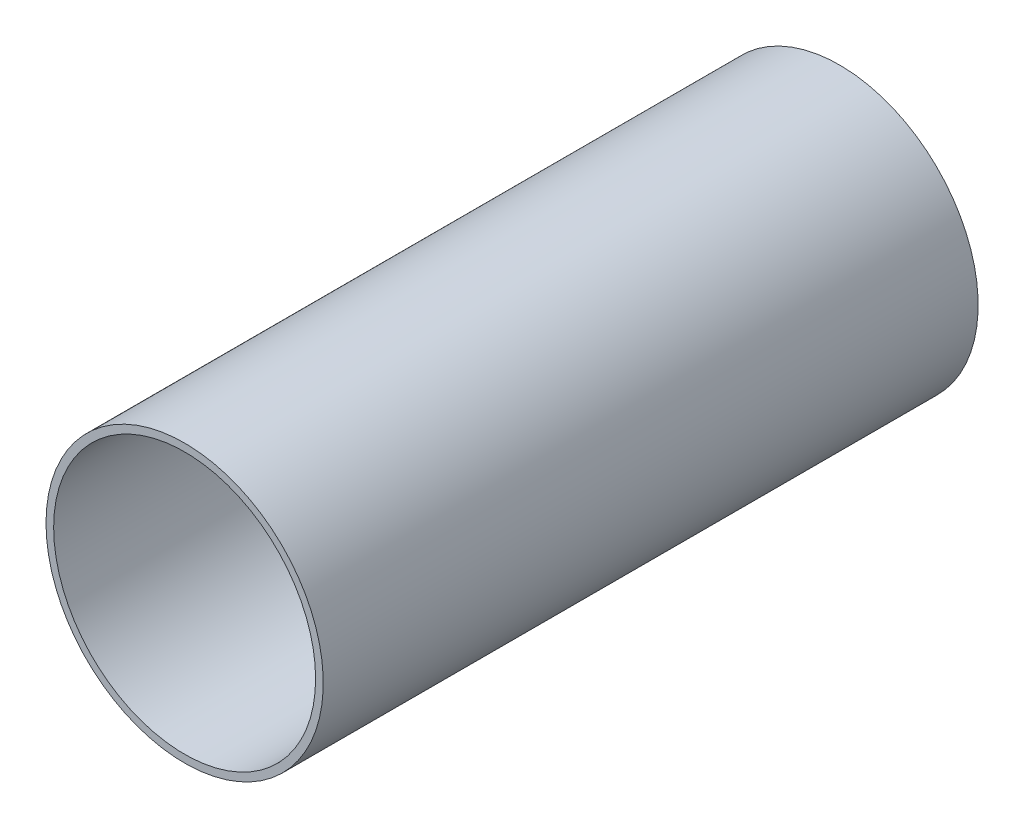
ISO-10303-21;
HEADER;
FILE_DESCRIPTION(('STEP AP214'),'2;1');
FILE_NAME('part.step','',(''),(''),'','','');
FILE_SCHEMA(('AUTOMOTIVE_DESIGN { 1 0 10303 214 1 1 1 1 }'));
ENDSEC;
DATA;
#1=APPLICATION_CONTEXT('core data for automotive mechanical design processes');
#2=APPLICATION_PROTOCOL_DEFINITION('international standard','automotive_design',2000,#1);
#3=PRODUCT_CONTEXT('',#1,'mechanical');
#4=PRODUCT('Part','Part','',(#3));
#5=PRODUCT_RELATED_PRODUCT_CATEGORY('part','',(#4));
#6=PRODUCT_DEFINITION_FORMATION('','',#4);
#7=PRODUCT_DEFINITION_CONTEXT('part definition',#1,'design');
#8=PRODUCT_DEFINITION('design','',#6,#7);
#9=PRODUCT_DEFINITION_SHAPE('','',#8);
#10=(LENGTH_UNIT() NAMED_UNIT(*) SI_UNIT(.MILLI.,.METRE.));
#11=(NAMED_UNIT(*) PLANE_ANGLE_UNIT() SI_UNIT($,.RADIAN.));
#12=(NAMED_UNIT(*) SI_UNIT($,.STERADIAN.) SOLID_ANGLE_UNIT());
#13=UNCERTAINTY_MEASURE_WITH_UNIT(LENGTH_MEASURE(1.E-05),#10,'distance_accuracy_value','');
#14=(GEOMETRIC_REPRESENTATION_CONTEXT(3) GLOBAL_UNCERTAINTY_ASSIGNED_CONTEXT((#13)) GLOBAL_UNIT_ASSIGNED_CONTEXT((#10,
#11,#12)) REPRESENTATION_CONTEXT('',''));
#15=CARTESIAN_POINT('',(0.,0.,0.));
#16=DIRECTION('',(0.,0.,1.));
#17=DIRECTION('',(1.,0.,0.));
#18=AXIS2_PLACEMENT_3D('',#15,#16,#17);
#19=CARTESIAN_POINT('',(0.,0.,90.));
#20=DIRECTION('',(0.,0.,1.));
#21=DIRECTION('',(1.,0.,0.));
#22=AXIS2_PLACEMENT_3D('',#19,#20,#21);
#23=PLANE('',#22);
#24=CARTESIAN_POINT('',(0.,0.,90.));
#25=DIRECTION('',(0.,0.,1.));
#26=DIRECTION('',(1.,0.,0.));
#27=AXIS2_PLACEMENT_3D('',#24,#25,#26);
#28=CIRCLE('',#27,19.05);
#29=CARTESIAN_POINT('',(-19.05,0.,90.));
#30=VERTEX_POINT('',#29);
#31=EDGE_CURVE('E10',#30,#30,#28,.T.);
#32=ORIENTED_EDGE('',*,*,#31,.T.);
#33=EDGE_LOOP('',(#32));
#34=FACE_BOUND('',#33,.T.);
#35=CARTESIAN_POINT('',(0.,0.,90.));
#36=DIRECTION('',(0.,0.,1.));
#37=DIRECTION('',(1.,0.,0.));
#38=AXIS2_PLACEMENT_3D('',#35,#36,#37);
#39=CIRCLE('',#38,18.);
#40=CARTESIAN_POINT('',(-18.,0.,90.));
#41=VERTEX_POINT('',#40);
#42=EDGE_CURVE('E46',#41,#41,#39,.T.);
#43=ORIENTED_EDGE('',*,*,#42,.F.);
#44=EDGE_LOOP('',(#43));
#45=FACE_BOUND('',#44,.T.);
#46=ADVANCED_FACE('F35',(#34,#45),#23,.T.);
#47=CARTESIAN_POINT('',(0.,0.,0.));
#48=DIRECTION('',(0.,0.,1.));
#49=DIRECTION('',(1.,0.,0.));
#50=AXIS2_PLACEMENT_3D('',#47,#48,#49);
#51=PLANE('',#50);
#52=CARTESIAN_POINT('',(0.,0.,0.));
#53=DIRECTION('',(0.,0.,1.));
#54=DIRECTION('',(1.,0.,0.));
#55=AXIS2_PLACEMENT_3D('',#52,#53,#54);
#56=CIRCLE('',#55,19.05);
#57=CARTESIAN_POINT('',(-19.05,0.,0.));
#58=VERTEX_POINT('',#57);
#59=EDGE_CURVE('E39',#58,#58,#56,.T.);
#60=ORIENTED_EDGE('',*,*,#59,.F.);
#61=EDGE_LOOP('',(#60));
#62=FACE_BOUND('',#61,.T.);
#63=CARTESIAN_POINT('',(0.,0.,0.));
#64=DIRECTION('',(0.,0.,1.));
#65=DIRECTION('',(1.,0.,0.));
#66=AXIS2_PLACEMENT_3D('',#63,#64,#65);
#67=CIRCLE('',#66,18.);
#68=CARTESIAN_POINT('',(-18.,0.,0.));
#69=VERTEX_POINT('',#68);
#70=EDGE_CURVE('E48',#69,#69,#67,.T.);
#71=ORIENTED_EDGE('',*,*,#70,.T.);
#72=EDGE_LOOP('',(#71));
#73=FACE_BOUND('',#72,.T.);
#74=ADVANCED_FACE('F58',(#62,#73),#51,.F.);
#75=CARTESIAN_POINT('',(0.,0.,90.));
#76=DIRECTION('',(0.,0.,-1.));
#77=DIRECTION('',(-1.,0.,0.));
#78=AXIS2_PLACEMENT_3D('',#75,#76,#77);
#79=CYLINDRICAL_SURFACE('',#78,19.05);
#80=CARTESIAN_POINT('',(-19.05,0.,90.));
#81=CARTESIAN_POINT('',(-19.05,0.,89.0625));
#82=CARTESIAN_POINT('',(-19.05,0.,88.125));
#83=CARTESIAN_POINT('',(-19.05,0.,86.25));
#84=CARTESIAN_POINT('',(-19.05,0.,85.3125));
#85=CARTESIAN_POINT('',(-19.05,0.,83.4375));
#86=CARTESIAN_POINT('',(-19.05,0.,82.5));
#87=CARTESIAN_POINT('',(-19.05,0.,80.625));
#88=CARTESIAN_POINT('',(-19.05,0.,79.6875));
#89=CARTESIAN_POINT('',(-19.05,0.,77.8125));
#90=CARTESIAN_POINT('',(-19.05,0.,76.875));
#91=CARTESIAN_POINT('',(-19.05,0.,75.));
#92=CARTESIAN_POINT('',(-19.05,0.,74.0625));
#93=CARTESIAN_POINT('',(-19.05,0.,72.1875));
#94=CARTESIAN_POINT('',(-19.05,0.,71.25));
#95=CARTESIAN_POINT('',(-19.05,0.,69.375));
#96=CARTESIAN_POINT('',(-19.05,0.,68.4375));
#97=CARTESIAN_POINT('',(-19.05,0.,66.5625));
#98=CARTESIAN_POINT('',(-19.05,0.,65.625));
#99=CARTESIAN_POINT('',(-19.05,0.,63.75));
#100=CARTESIAN_POINT('',(-19.05,0.,62.8125));
#101=CARTESIAN_POINT('',(-19.05,0.,60.9375));
#102=CARTESIAN_POINT('',(-19.05,0.,60.));
#103=CARTESIAN_POINT('',(-19.05,0.,58.125));
#104=CARTESIAN_POINT('',(-19.05,0.,57.1875));
#105=CARTESIAN_POINT('',(-19.05,0.,55.3125));
#106=CARTESIAN_POINT('',(-19.05,0.,54.375));
#107=CARTESIAN_POINT('',(-19.05,0.,52.5));
#108=CARTESIAN_POINT('',(-19.05,0.,51.5625));
#109=CARTESIAN_POINT('',(-19.05,0.,49.6875));
#110=CARTESIAN_POINT('',(-19.05,0.,48.75));
#111=CARTESIAN_POINT('',(-19.05,0.,46.875));
#112=CARTESIAN_POINT('',(-19.05,0.,45.9375));
#113=CARTESIAN_POINT('',(-19.05,0.,44.0625));
#114=CARTESIAN_POINT('',(-19.05,0.,43.125));
#115=CARTESIAN_POINT('',(-19.05,0.,41.25));
#116=CARTESIAN_POINT('',(-19.05,0.,40.3125));
#117=CARTESIAN_POINT('',(-19.05,0.,38.4375));
#118=CARTESIAN_POINT('',(-19.05,0.,37.5));
#119=CARTESIAN_POINT('',(-19.05,0.,35.625));
#120=CARTESIAN_POINT('',(-19.05,0.,34.6875));
#121=CARTESIAN_POINT('',(-19.05,0.,32.8125));
#122=CARTESIAN_POINT('',(-19.05,0.,31.875));
#123=CARTESIAN_POINT('',(-19.05,0.,30.));
#124=CARTESIAN_POINT('',(-19.05,0.,29.0625));
#125=CARTESIAN_POINT('',(-19.05,0.,27.1875));
#126=CARTESIAN_POINT('',(-19.05,0.,26.25));
#127=CARTESIAN_POINT('',(-19.05,0.,24.375));
#128=CARTESIAN_POINT('',(-19.05,0.,23.4375));
#129=CARTESIAN_POINT('',(-19.05,0.,21.5625));
#130=CARTESIAN_POINT('',(-19.05,0.,20.625));
#131=CARTESIAN_POINT('',(-19.05,0.,18.75));
#132=CARTESIAN_POINT('',(-19.05,0.,17.8125));
#133=CARTESIAN_POINT('',(-19.05,0.,15.9375));
#134=CARTESIAN_POINT('',(-19.05,0.,15.));
#135=CARTESIAN_POINT('',(-19.05,0.,13.125));
#136=CARTESIAN_POINT('',(-19.05,0.,12.1875));
#137=CARTESIAN_POINT('',(-19.05,0.,10.3125));
#138=CARTESIAN_POINT('',(-19.05,0.,9.37499999999999));
#139=CARTESIAN_POINT('',(-19.05,0.,7.49999999999999));
#140=CARTESIAN_POINT('',(-19.05,0.,6.56249999999999));
#141=CARTESIAN_POINT('',(-19.05,0.,4.68749999999999));
#142=CARTESIAN_POINT('',(-19.05,0.,3.74999999999998));
#143=CARTESIAN_POINT('',(-19.05,0.,1.87499999999998));
#144=CARTESIAN_POINT('',(-19.05,0.,0.937499999999986));
#145=CARTESIAN_POINT('',(-19.05,0.,0.));
#146=B_SPLINE_CURVE_WITH_KNOTS('',3,(#80,#81,#82,#83,#84,#85,#86,#87,#88,#89,#90,#91,#92,#93,
#94,#95,#96,#97,#98,#99,#100,#101,#102,#103,#104,#105,#106,#107,#108,#109,#110,#111,#112,#113,
#114,#115,#116,#117,#118,#119,#120,#121,#122,#123,#124,#125,#126,#127,#128,#129,#130,#131,#132,
#133,#134,#135,#136,#137,#138,#139,#140,#141,#142,#143,#144,#145),.UNSPECIFIED.,.F.,.F.,(4,2,2,
2,2,2,2,2,2,2,2,2,2,2,2,2,2,2,2,2,2,2,2,2,2,2,2,2,2,2,2,2,4),(0.,2.8125,5.62499999999999,
8.43749999999999,11.25,14.0625,16.875,19.6875,22.5,25.3125,28.125,30.9375,33.75,36.5625,39.375,
42.1875,45.,47.8125,50.625,53.4375,56.25,59.0625,61.875,64.6875,67.5,70.3125,73.125,75.9375,
78.75,81.5625,84.375,87.1875,90.),.UNSPECIFIED.);
#147=EDGE_CURVE('BSEAM37',#30,#58,#146,.T.);
#148=ORIENTED_EDGE('',*,*,#31,.F.);
#149=ORIENTED_EDGE('',*,*,#59,.T.);
#150=ORIENTED_EDGE('',*,*,#147,.T.);
#151=ORIENTED_EDGE('',*,*,#147,.F.);
#152=EDGE_LOOP('',(#148,#150,#149,#151));
#153=FACE_BOUND('',#152,.T.);
#154=ADVANCED_FACE('F37',(#153),#79,.T.);
#155=CARTESIAN_POINT('',(0.,0.,90.));
#156=DIRECTION('',(0.,0.,-1.));
#157=DIRECTION('',(-1.,0.,0.));
#158=AXIS2_PLACEMENT_3D('',#155,#156,#157);
#159=CYLINDRICAL_SURFACE('',#158,18.);
#160=CARTESIAN_POINT('',(-18.,0.,90.));
#161=CARTESIAN_POINT('',(-18.,0.,89.0625));
#162=CARTESIAN_POINT('',(-18.,0.,88.125));
#163=CARTESIAN_POINT('',(-18.,0.,86.25));
#164=CARTESIAN_POINT('',(-18.,0.,85.3125));
#165=CARTESIAN_POINT('',(-18.,0.,83.4375));
#166=CARTESIAN_POINT('',(-18.,0.,82.5));
#167=CARTESIAN_POINT('',(-18.,0.,80.625));
#168=CARTESIAN_POINT('',(-18.,0.,79.6875));
#169=CARTESIAN_POINT('',(-18.,0.,77.8125));
#170=CARTESIAN_POINT('',(-18.,0.,76.875));
#171=CARTESIAN_POINT('',(-18.,0.,75.));
#172=CARTESIAN_POINT('',(-18.,0.,74.0625));
#173=CARTESIAN_POINT('',(-18.,0.,72.1875));
#174=CARTESIAN_POINT('',(-18.,0.,71.25));
#175=CARTESIAN_POINT('',(-18.,0.,69.375));
#176=CARTESIAN_POINT('',(-18.,0.,68.4375));
#177=CARTESIAN_POINT('',(-18.,0.,66.5625));
#178=CARTESIAN_POINT('',(-18.,0.,65.625));
#179=CARTESIAN_POINT('',(-18.,0.,63.75));
#180=CARTESIAN_POINT('',(-18.,0.,62.8125));
#181=CARTESIAN_POINT('',(-18.,0.,60.9375));
#182=CARTESIAN_POINT('',(-18.,0.,60.));
#183=CARTESIAN_POINT('',(-18.,0.,58.125));
#184=CARTESIAN_POINT('',(-18.,0.,57.1875));
#185=CARTESIAN_POINT('',(-18.,0.,55.3125));
#186=CARTESIAN_POINT('',(-18.,0.,54.375));
#187=CARTESIAN_POINT('',(-18.,0.,52.5));
#188=CARTESIAN_POINT('',(-18.,0.,51.5625));
#189=CARTESIAN_POINT('',(-18.,0.,49.6875));
#190=CARTESIAN_POINT('',(-18.,0.,48.75));
#191=CARTESIAN_POINT('',(-18.,0.,46.875));
#192=CARTESIAN_POINT('',(-18.,0.,45.9375));
#193=CARTESIAN_POINT('',(-18.,0.,44.0625));
#194=CARTESIAN_POINT('',(-18.,0.,43.125));
#195=CARTESIAN_POINT('',(-18.,0.,41.25));
#196=CARTESIAN_POINT('',(-18.,0.,40.3125));
#197=CARTESIAN_POINT('',(-18.,0.,38.4375));
#198=CARTESIAN_POINT('',(-18.,0.,37.5));
#199=CARTESIAN_POINT('',(-18.,0.,35.625));
#200=CARTESIAN_POINT('',(-18.,0.,34.6875));
#201=CARTESIAN_POINT('',(-18.,0.,32.8125));
#202=CARTESIAN_POINT('',(-18.,0.,31.875));
#203=CARTESIAN_POINT('',(-18.,0.,30.));
#204=CARTESIAN_POINT('',(-18.,0.,29.0625));
#205=CARTESIAN_POINT('',(-18.,0.,27.1875));
#206=CARTESIAN_POINT('',(-18.,0.,26.25));
#207=CARTESIAN_POINT('',(-18.,0.,24.375));
#208=CARTESIAN_POINT('',(-18.,0.,23.4375));
#209=CARTESIAN_POINT('',(-18.,0.,21.5625));
#210=CARTESIAN_POINT('',(-18.,0.,20.625));
#211=CARTESIAN_POINT('',(-18.,0.,18.75));
#212=CARTESIAN_POINT('',(-18.,0.,17.8125));
#213=CARTESIAN_POINT('',(-18.,0.,15.9375));
#214=CARTESIAN_POINT('',(-18.,0.,15.));
#215=CARTESIAN_POINT('',(-18.,0.,13.125));
#216=CARTESIAN_POINT('',(-18.,0.,12.1875));
#217=CARTESIAN_POINT('',(-18.,0.,10.3125));
#218=CARTESIAN_POINT('',(-18.,0.,9.37499999999999));
#219=CARTESIAN_POINT('',(-18.,0.,7.49999999999999));
#220=CARTESIAN_POINT('',(-18.,0.,6.56249999999999));
#221=CARTESIAN_POINT('',(-18.,0.,4.68749999999999));
#222=CARTESIAN_POINT('',(-18.,0.,3.74999999999998));
#223=CARTESIAN_POINT('',(-18.,0.,1.87499999999998));
#224=CARTESIAN_POINT('',(-18.,0.,0.937499999999986));
#225=CARTESIAN_POINT('',(-18.,0.,0.));
#226=B_SPLINE_CURVE_WITH_KNOTS('',3,(#160,#161,#162,#163,#164,#165,#166,#167,#168,#169,#170,
#171,#172,#173,#174,#175,#176,#177,#178,#179,#180,#181,#182,#183,#184,#185,#186,#187,#188,#189,
#190,#191,#192,#193,#194,#195,#196,#197,#198,#199,#200,#201,#202,#203,#204,#205,#206,#207,#208,
#209,#210,#211,#212,#213,#214,#215,#216,#217,#218,#219,#220,#221,#222,#223,#224,#225),
.UNSPECIFIED.,.F.,.F.,(4,2,2,2,2,2,2,2,2,2,2,2,2,2,2,2,2,2,2,2,2,2,2,2,2,2,2,2,2,2,2,2,4),(0.,
2.81250000000001,5.62500000000001,8.43750000000001,11.25,14.0625,16.875,19.6875,22.5,25.3125,
28.125,30.9375,33.75,36.5625,39.375,42.1875,45.,47.8125,50.625,53.4375,56.25,59.0625,61.875,
64.6875,67.5,70.3125,73.125,75.9375,78.75,81.5625,84.375,87.1875,90.),.UNSPECIFIED.);
#227=EDGE_CURVE('BSEAM54',#41,#69,#226,.T.);
#228=ORIENTED_EDGE('',*,*,#42,.T.);
#229=ORIENTED_EDGE('',*,*,#70,.F.);
#230=ORIENTED_EDGE('',*,*,#227,.T.);
#231=ORIENTED_EDGE('',*,*,#227,.F.);
#232=EDGE_LOOP('',(#228,#230,#229,#231));
#233=FACE_BOUND('',#232,.T.);
#234=ADVANCED_FACE('F54',(#233),#159,.F.);
#235=CLOSED_SHELL('',(#46,#74,#154,#234));
#236=MANIFOLD_SOLID_BREP('B2',#235);
#237=ADVANCED_BREP_SHAPE_REPRESENTATION('',(#18,#236),#14);
#238=SHAPE_DEFINITION_REPRESENTATION(#9,#237);
ENDSEC;
END-ISO-10303-21;
